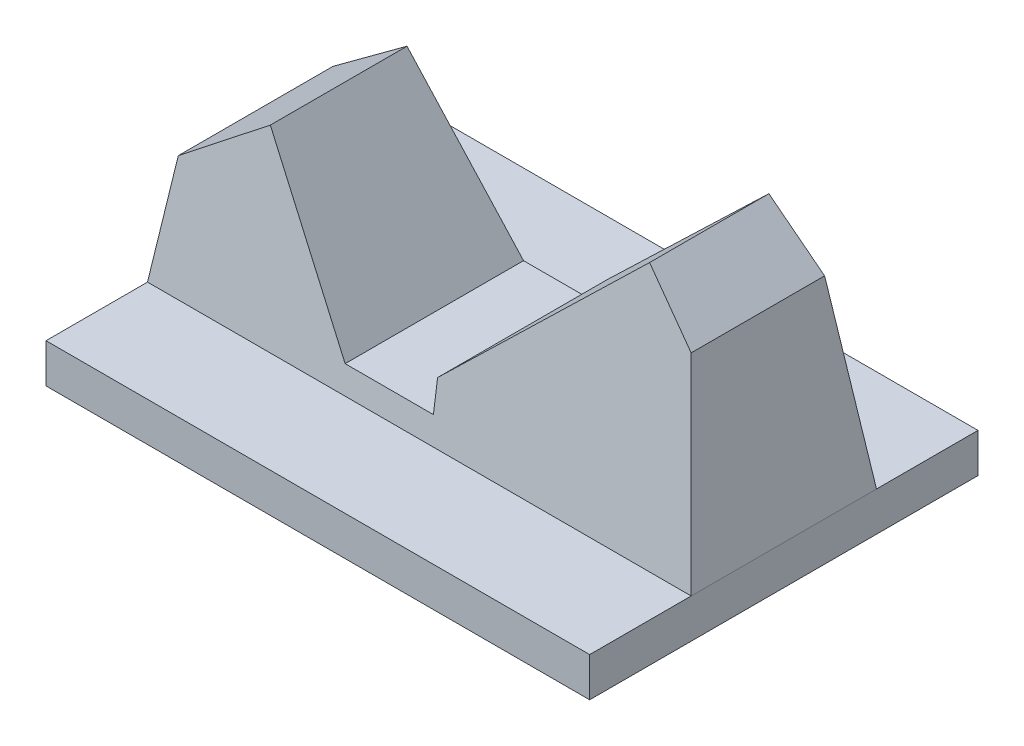
ISO-10303-21;
HEADER;
FILE_DESCRIPTION(('STEP AP214'),'2;1');
FILE_NAME('part.step','',(''),(''),'','','');
FILE_SCHEMA(('AUTOMOTIVE_DESIGN { 1 0 10303 214 1 1 1 1 }'));
ENDSEC;
DATA;
#1=APPLICATION_CONTEXT('core data for automotive mechanical design processes');
#2=APPLICATION_PROTOCOL_DEFINITION('international standard','automotive_design',2000,#1);
#3=PRODUCT_CONTEXT('',#1,'mechanical');
#4=PRODUCT('Part','Part','',(#3));
#5=PRODUCT_RELATED_PRODUCT_CATEGORY('part','',(#4));
#6=PRODUCT_DEFINITION_FORMATION('','',#4);
#7=PRODUCT_DEFINITION_CONTEXT('part definition',#1,'design');
#8=PRODUCT_DEFINITION('design','',#6,#7);
#9=PRODUCT_DEFINITION_SHAPE('','',#8);
#10=(LENGTH_UNIT() NAMED_UNIT(*) SI_UNIT(.MILLI.,.METRE.));
#11=(NAMED_UNIT(*) PLANE_ANGLE_UNIT() SI_UNIT($,.RADIAN.));
#12=(NAMED_UNIT(*) SI_UNIT($,.STERADIAN.) SOLID_ANGLE_UNIT());
#13=UNCERTAINTY_MEASURE_WITH_UNIT(LENGTH_MEASURE(1.E-05),#10,'distance_accuracy_value','');
#14=(GEOMETRIC_REPRESENTATION_CONTEXT(3) GLOBAL_UNCERTAINTY_ASSIGNED_CONTEXT((#13)) GLOBAL_UNIT_ASSIGNED_CONTEXT((#10,
#11,#12)) REPRESENTATION_CONTEXT('',''));
#15=CARTESIAN_POINT('',(0.,0.,0.));
#16=DIRECTION('',(0.,0.,1.));
#17=DIRECTION('',(1.,0.,0.));
#18=AXIS2_PLACEMENT_3D('',#15,#16,#17);
#19=CARTESIAN_POINT('',(-39.116,5.6388,-13.335));
#20=DIRECTION('',(-0.99026806874157,0.139173100960065,0.));
#21=DIRECTION('',(-0.139173100960065,-0.99026806874157,0.));
#22=AXIS2_PLACEMENT_3D('',#19,#20,#21);
#23=PLANE('',#22);
#24=DIRECTION('',(0.,0.,-1.));
#25=VECTOR('',#24,1.);
#26=CARTESIAN_POINT('',(-36.9012837934714,21.397324639607,-13.335));
#27=LINE('',#26,#25);
#28=CARTESIAN_POINT('',(-36.9012837934714,21.397324639607,-11.1202837934714));
#29=VERTEX_POINT('',#28);
#30=CARTESIAN_POINT('',(-36.9012837934714,21.397324639607,11.1202837934714));
#31=VERTEX_POINT('',#30);
#32=EDGE_CURVE('E250',#29,#31,#27,.F.);
#33=ORIENTED_EDGE('',*,*,#32,.F.);
#34=DIRECTION('',(-0.137844537491629,-0.980814848463989,-0.137844537491629));
#35=VECTOR('',#34,1.);
#36=CARTESIAN_POINT('',(-39.116,5.6388,-13.335));
#37=LINE('',#36,#35);
#38=CARTESIAN_POINT('',(-39.116,5.6388,-13.335));
#39=VERTEX_POINT('',#38);
#40=EDGE_CURVE('E173',#29,#39,#37,.T.);
#41=ORIENTED_EDGE('',*,*,#40,.T.);
#42=DIRECTION('',(0.,0.,1.));
#43=VECTOR('',#42,1.);
#44=CARTESIAN_POINT('',(-39.116,5.6388,-13.335));
#45=LINE('',#44,#43);
#46=CARTESIAN_POINT('',(-39.116,5.6388,13.335));
#47=VERTEX_POINT('',#46);
#48=EDGE_CURVE('E246',#39,#47,#45,.T.);
#49=ORIENTED_EDGE('',*,*,#48,.T.);
#50=DIRECTION('',(-0.137844537491629,-0.980814848463989,0.137844537491629));
#51=VECTOR('',#50,1.);
#52=CARTESIAN_POINT('',(-39.116,5.6388,13.335));
#53=LINE('',#52,#51);
#54=EDGE_CURVE('E184',#31,#47,#53,.T.);
#55=ORIENTED_EDGE('',*,*,#54,.F.);
#56=EDGE_LOOP('',(#33,#41,#49,#55));
#57=FACE_BOUND('',#56,.T.);
#58=ADVANCED_FACE('F36',(#57),#23,.T.);
#59=CARTESIAN_POINT('',(-39.116,5.6388,13.335));
#60=DIRECTION('',(0.,0.139173100960065,0.99026806874157));
#61=DIRECTION('',(0.,-0.99026806874157,0.139173100960065));
#62=AXIS2_PLACEMENT_3D('',#59,#60,#61);
#63=PLANE('',#62);
#64=DIRECTION('',(-0.791535572648888,-0.605175687040123,0.0850518961982123));
#65=VECTOR('',#64,1.);
#66=CARTESIAN_POINT('',(-45.9865832763187,14.4510766799637,12.0965152797695));
#67=LINE('',#66,#65);
#68=CARTESIAN_POINT('',(-24.9417813520281,30.5410704884988,9.83521411956165));
#69=VERTEX_POINT('',#68);
#70=EDGE_CURVE('E170',#31,#69,#67,.F.);
#71=ORIENTED_EDGE('',*,*,#70,.F.);
#72=ORIENTED_EDGE('',*,*,#54,.T.);
#73=DIRECTION('',(1.,0.,0.));
#74=VECTOR('',#73,1.);
#75=CARTESIAN_POINT('',(-39.116,5.6388,13.335));
#76=LINE('',#75,#74);
#77=CARTESIAN_POINT('',(39.116,5.6388,13.335));
#78=VERTEX_POINT('',#77);
#79=EDGE_CURVE('E245',#47,#78,#76,.T.);
#80=ORIENTED_EDGE('',*,*,#79,.T.);
#81=DIRECTION('',(0.137844537491629,-0.980814848463989,0.137844537491629));
#82=VECTOR('',#81,1.);
#83=CARTESIAN_POINT('',(38.6092402225108,9.24458317726891,12.8282402225108));
#84=LINE('',#83,#82);
#85=CARTESIAN_POINT('',(35.3829233518817,32.2010205533605,9.6019233518817));
#86=VERTEX_POINT('',#85);
#87=EDGE_CURVE('E179',#86,#78,#84,.T.);
#88=ORIENTED_EDGE('',*,*,#87,.F.);
#89=DIRECTION('',(-0.691135465148828,0.715691725097354,-0.100583912434777));
#90=VECTOR('',#89,1.);
#91=CARTESIAN_POINT('',(13.1954021093097,55.1768713879159,6.37287809759564));
#92=LINE('',#91,#90);
#93=CARTESIAN_POINT('',(28.3827094650445,39.4499542361981,8.58315216139342));
#94=VERTEX_POINT('',#93);
#95=EDGE_CURVE('E259',#94,#86,#92,.F.);
#96=ORIENTED_EDGE('',*,*,#95,.F.);
#97=DIRECTION('',(-0.715936026723942,-0.691371384487291,0.097165911465192));
#98=VECTOR('',#97,1.);
#99=CARTESIAN_POINT('',(-23.2810527045669,-10.4411609552982,15.5948911346395));
#100=LINE('',#99,#98);
#101=CARTESIAN_POINT('',(1.524,13.5128,12.2283814675534));
#102=VERTEX_POINT('',#101);
#103=EDGE_CURVE('E143',#102,#94,#100,.F.);
#104=ORIENTED_EDGE('',*,*,#103,.F.);
#105=DIRECTION('',(0.,-0.99026806874157,0.139173100960065));
#106=VECTOR('',#105,1.);
#107=CARTESIAN_POINT('',(1.524,5.6388,13.335));
#108=LINE('',#107,#106);
#109=CARTESIAN_POINT('',(1.524,9.1948,12.8352367917983));
#110=VERTEX_POINT('',#109);
#111=EDGE_CURVE('E265',#110,#102,#108,.F.);
#112=ORIENTED_EDGE('',*,*,#111,.F.);
#113=DIRECTION('',(-1.,0.,0.));
#114=VECTOR('',#113,1.);
#115=CARTESIAN_POINT('',(-39.116,9.19479999999999,12.8352367917983));
#116=LINE('',#115,#114);
#117=CARTESIAN_POINT('',(-11.176,9.1948,12.8352367917983));
#118=VERTEX_POINT('',#117);
#119=EDGE_CURVE('E263',#118,#110,#116,.F.);
#120=ORIENTED_EDGE('',*,*,#119,.F.);
#121=DIRECTION('',(-0.538218757914415,0.834603056275649,-0.117295810174147));
#122=VECTOR('',#121,1.);
#123=CARTESIAN_POINT('',(-17.6407411425429,19.2195206851442,11.4263541790498));
#124=LINE('',#123,#122);
#125=EDGE_CURVE('E261',#69,#118,#124,.F.);
#126=ORIENTED_EDGE('',*,*,#125,.F.);
#127=EDGE_LOOP('',(#71,#72,#80,#88,#96,#104,#112,#120,#126));
#128=FACE_BOUND('',#127,.T.);
#129=ADVANCED_FACE('F258',(#128),#63,.T.);
#130=CARTESIAN_POINT('',(39.116,5.6388,-13.335));
#131=DIRECTION('',(0.99026806874157,0.139173100960065,0.));
#132=DIRECTION('',(-0.139173100960065,0.99026806874157,0.));
#133=AXIS2_PLACEMENT_3D('',#130,#131,#132);
#134=PLANE('',#133);
#135=DIRECTION('',(0.,0.,1.));
#136=VECTOR('',#135,1.);
#137=CARTESIAN_POINT('',(35.3829233518817,32.2010205533605,-13.335));
#138=LINE('',#137,#136);
#139=CARTESIAN_POINT('',(35.3829233518817,32.2010205533605,-9.6019233518817));
#140=VERTEX_POINT('',#139);
#141=EDGE_CURVE('E51',#86,#140,#138,.F.);
#142=ORIENTED_EDGE('',*,*,#141,.F.);
#143=ORIENTED_EDGE('',*,*,#87,.T.);
#144=DIRECTION('',(0.,0.,-1.));
#145=VECTOR('',#144,1.);
#146=CARTESIAN_POINT('',(39.116,5.6388,-13.335));
#147=LINE('',#146,#145);
#148=CARTESIAN_POINT('',(39.116,5.6388,-13.335));
#149=VERTEX_POINT('',#148);
#150=EDGE_CURVE('E181',#78,#149,#147,.T.);
#151=ORIENTED_EDGE('',*,*,#150,.T.);
#152=DIRECTION('',(0.137844537491629,-0.980814848463989,-0.137844537491629));
#153=VECTOR('',#152,1.);
#154=CARTESIAN_POINT('',(37.6295046526983,16.2157639866555,-11.8485046526983));
#155=LINE('',#154,#153);
#156=EDGE_CURVE('E58',#140,#149,#155,.T.);
#157=ORIENTED_EDGE('',*,*,#156,.F.);
#158=EDGE_LOOP('',(#142,#143,#151,#157));
#159=FACE_BOUND('',#158,.T.);
#160=ADVANCED_FACE('F255',(#159),#134,.T.);
#161=CARTESIAN_POINT('',(-39.116,5.6388,-13.335));
#162=DIRECTION('',(0.,0.139173100960065,-0.99026806874157));
#163=DIRECTION('',(0.,0.99026806874157,0.139173100960065));
#164=AXIS2_PLACEMENT_3D('',#161,#162,#163);
#165=PLANE('',#164);
#166=DIRECTION('',(0.791535572648888,0.605175687040123,0.085051896198212));
#167=VECTOR('',#166,1.);
#168=CARTESIAN_POINT('',(-45.9865832763187,14.4510766799637,-12.0965152797695));
#169=LINE('',#168,#167);
#170=CARTESIAN_POINT('',(-24.9417813520281,30.5410704884988,-9.83521411956164));
#171=VERTEX_POINT('',#170);
#172=EDGE_CURVE('E12',#171,#29,#169,.F.);
#173=ORIENTED_EDGE('',*,*,#172,.F.);
#174=DIRECTION('',(0.538218757914415,-0.834603056275649,-0.117295810174147));
#175=VECTOR('',#174,1.);
#176=CARTESIAN_POINT('',(-17.6407411425429,19.2195206851442,-11.4263541790498));
#177=LINE('',#176,#175);
#178=CARTESIAN_POINT('',(-11.176,9.1948,-12.8352367917983));
#179=VERTEX_POINT('',#178);
#180=EDGE_CURVE('E44',#179,#171,#177,.F.);
#181=ORIENTED_EDGE('',*,*,#180,.F.);
#182=DIRECTION('',(1.,0.,0.));
#183=VECTOR('',#182,1.);
#184=CARTESIAN_POINT('',(-39.116,9.19479999999999,-12.8352367917983));
#185=LINE('',#184,#183);
#186=CARTESIAN_POINT('',(1.524,9.1948,-12.8352367917983));
#187=VERTEX_POINT('',#186);
#188=EDGE_CURVE('E152',#187,#179,#185,.F.);
#189=ORIENTED_EDGE('',*,*,#188,.F.);
#190=DIRECTION('',(0.,0.99026806874157,0.139173100960065));
#191=VECTOR('',#190,1.);
#192=CARTESIAN_POINT('',(1.524,5.6388,-13.335));
#193=LINE('',#192,#191);
#194=CARTESIAN_POINT('',(1.524,13.5128,-12.2283814675534));
#195=VERTEX_POINT('',#194);
#196=EDGE_CURVE('E150',#195,#187,#193,.F.);
#197=ORIENTED_EDGE('',*,*,#196,.F.);
#198=DIRECTION('',(0.715936026723942,0.691371384487291,0.0971659114651918));
#199=VECTOR('',#198,1.);
#200=CARTESIAN_POINT('',(-23.2810527045669,-10.4411609552982,-15.5948911346395));
#201=LINE('',#200,#199);
#202=CARTESIAN_POINT('',(28.3827094650445,39.4499542361981,-8.58315216139342));
#203=VERTEX_POINT('',#202);
#204=EDGE_CURVE('E135',#203,#195,#201,.F.);
#205=ORIENTED_EDGE('',*,*,#204,.F.);
#206=DIRECTION('',(0.691135465148828,-0.715691725097354,-0.100583912434777));
#207=VECTOR('',#206,1.);
#208=CARTESIAN_POINT('',(13.1954021093097,55.1768713879159,-6.37287809759563));
#209=LINE('',#208,#207);
#210=EDGE_CURVE('E129',#140,#203,#209,.F.);
#211=ORIENTED_EDGE('',*,*,#210,.F.);
#212=ORIENTED_EDGE('',*,*,#156,.T.);
#213=DIRECTION('',(-1.,0.,0.));
#214=VECTOR('',#213,1.);
#215=CARTESIAN_POINT('',(-39.116,5.6388,-13.335));
#216=LINE('',#215,#214);
#217=EDGE_CURVE('E174',#149,#39,#216,.T.);
#218=ORIENTED_EDGE('',*,*,#217,.T.);
#219=ORIENTED_EDGE('',*,*,#40,.F.);
#220=EDGE_LOOP('',(#173,#181,#189,#197,#205,#211,#212,#218,#219));
#221=FACE_BOUND('',#220,.T.);
#222=ADVANCED_FACE('F148',(#221),#165,.T.);
#223=CARTESIAN_POINT('',(0.,5.6388,0.));
#224=DIRECTION('',(0.,1.,0.));
#225=DIRECTION('',(0.,0.,1.));
#226=AXIS2_PLACEMENT_3D('',#223,#224,#225);
#227=PLANE('',#226);
#228=ORIENTED_EDGE('',*,*,#217,.F.);
#229=DIRECTION('',(0.,0.,1.));
#230=VECTOR('',#229,1.);
#231=CARTESIAN_POINT('',(39.116,5.6388,-27.94));
#232=LINE('',#231,#230);
#233=CARTESIAN_POINT('',(39.116,5.6388,-27.94));
#234=VERTEX_POINT('',#233);
#235=EDGE_CURVE('E195',#234,#149,#232,.T.);
#236=ORIENTED_EDGE('',*,*,#235,.F.);
#237=DIRECTION('',(1.,0.,0.));
#238=VECTOR('',#237,1.);
#239=CARTESIAN_POINT('',(-39.116,5.6388,-27.94));
#240=LINE('',#239,#238);
#241=CARTESIAN_POINT('',(-39.116,5.6388,-27.94));
#242=VERTEX_POINT('',#241);
#243=EDGE_CURVE('E198',#242,#234,#240,.T.);
#244=ORIENTED_EDGE('',*,*,#243,.F.);
#245=DIRECTION('',(0.,0.,1.));
#246=VECTOR('',#245,1.);
#247=CARTESIAN_POINT('',(-39.116,5.6388,-27.94));
#248=LINE('',#247,#246);
#249=EDGE_CURVE('E187',#242,#39,#248,.T.);
#250=ORIENTED_EDGE('',*,*,#249,.T.);
#251=EDGE_LOOP('',(#228,#236,#244,#250));
#252=FACE_BOUND('',#251,.T.);
#253=ADVANCED_FACE('F309',(#252),#227,.T.);
#254=CARTESIAN_POINT('',(-39.116,5.6388,-27.94));
#255=DIRECTION('',(1.,0.,0.));
#256=DIRECTION('',(0.,0.,-1.));
#257=AXIS2_PLACEMENT_3D('',#254,#255,#256);
#258=PLANE('',#257);
#259=DIRECTION('',(0.,0.,1.));
#260=VECTOR('',#259,1.);
#261=CARTESIAN_POINT('',(-39.116,0.,-27.94));
#262=LINE('',#261,#260);
#263=CARTESIAN_POINT('',(-39.116,0.,-27.94));
#264=VERTEX_POINT('',#263);
#265=CARTESIAN_POINT('',(-39.116,0.,27.94));
#266=VERTEX_POINT('',#265);
#267=EDGE_CURVE('E202',#264,#266,#262,.T.);
#268=ORIENTED_EDGE('',*,*,#267,.T.);
#269=DIRECTION('',(0.,-1.,0.));
#270=VECTOR('',#269,1.);
#271=CARTESIAN_POINT('',(-39.116,5.6388,27.94));
#272=LINE('',#271,#270);
#273=CARTESIAN_POINT('',(-39.116,5.6388,27.94));
#274=VERTEX_POINT('',#273);
#275=EDGE_CURVE('E136',#274,#266,#272,.T.);
#276=ORIENTED_EDGE('',*,*,#275,.F.);
#277=EDGE_CURVE('E191',#47,#274,#248,.T.);
#278=ORIENTED_EDGE('',*,*,#277,.F.);
#279=ORIENTED_EDGE('',*,*,#48,.F.);
#280=ORIENTED_EDGE('',*,*,#249,.F.);
#281=DIRECTION('',(0.,-1.,0.));
#282=VECTOR('',#281,1.);
#283=CARTESIAN_POINT('',(-39.116,5.6388,-27.94));
#284=LINE('',#283,#282);
#285=EDGE_CURVE('E201',#242,#264,#284,.T.);
#286=ORIENTED_EDGE('',*,*,#285,.T.);
#287=EDGE_LOOP('',(#268,#276,#278,#279,#280,#286));
#288=FACE_BOUND('',#287,.T.);
#289=ADVANCED_FACE('F38',(#288),#258,.F.);
#290=CARTESIAN_POINT('',(-39.116,5.6388,27.94));
#291=DIRECTION('',(0.,0.,-1.));
#292=DIRECTION('',(-1.,0.,0.));
#293=AXIS2_PLACEMENT_3D('',#290,#291,#292);
#294=PLANE('',#293);
#295=DIRECTION('',(1.,0.,0.));
#296=VECTOR('',#295,1.);
#297=CARTESIAN_POINT('',(-39.116,0.,27.94));
#298=LINE('',#297,#296);
#299=CARTESIAN_POINT('',(39.116,0.,27.94));
#300=VERTEX_POINT('',#299);
#301=EDGE_CURVE('E205',#266,#300,#298,.T.);
#302=ORIENTED_EDGE('',*,*,#301,.T.);
#303=DIRECTION('',(0.,-1.,0.));
#304=VECTOR('',#303,1.);
#305=CARTESIAN_POINT('',(39.116,5.6388,27.94));
#306=LINE('',#305,#304);
#307=CARTESIAN_POINT('',(39.116,5.6388,27.94));
#308=VERTEX_POINT('',#307);
#309=EDGE_CURVE('E217',#308,#300,#306,.T.);
#310=ORIENTED_EDGE('',*,*,#309,.F.);
#311=DIRECTION('',(1.,0.,0.));
#312=VECTOR('',#311,1.);
#313=CARTESIAN_POINT('',(-39.116,5.6388,27.94));
#314=LINE('',#313,#312);
#315=EDGE_CURVE('E190',#274,#308,#314,.T.);
#316=ORIENTED_EDGE('',*,*,#315,.F.);
#317=ORIENTED_EDGE('',*,*,#275,.T.);
#318=EDGE_LOOP('',(#302,#310,#316,#317));
#319=FACE_BOUND('',#318,.T.);
#320=ADVANCED_FACE('F222',(#319),#294,.F.);
#321=CARTESIAN_POINT('',(39.116,5.6388,-27.94));
#322=DIRECTION('',(1.,0.,0.));
#323=DIRECTION('',(0.,0.,-1.));
#324=AXIS2_PLACEMENT_3D('',#321,#322,#323);
#325=PLANE('',#324);
#326=DIRECTION('',(0.,0.,1.));
#327=VECTOR('',#326,1.);
#328=CARTESIAN_POINT('',(39.116,0.,-27.94));
#329=LINE('',#328,#327);
#330=CARTESIAN_POINT('',(39.116,0.,-27.94));
#331=VERTEX_POINT('',#330);
#332=EDGE_CURVE('E208',#331,#300,#329,.T.);
#333=ORIENTED_EDGE('',*,*,#332,.F.);
#334=DIRECTION('',(0.,-1.,0.));
#335=VECTOR('',#334,1.);
#336=CARTESIAN_POINT('',(39.116,5.6388,-27.94));
#337=LINE('',#336,#335);
#338=EDGE_CURVE('E215',#234,#331,#337,.T.);
#339=ORIENTED_EDGE('',*,*,#338,.F.);
#340=ORIENTED_EDGE('',*,*,#235,.T.);
#341=ORIENTED_EDGE('',*,*,#150,.F.);
#342=EDGE_CURVE('E194',#78,#308,#232,.T.);
#343=ORIENTED_EDGE('',*,*,#342,.T.);
#344=ORIENTED_EDGE('',*,*,#309,.T.);
#345=EDGE_LOOP('',(#333,#339,#340,#341,#343,#344));
#346=FACE_BOUND('',#345,.T.);
#347=ADVANCED_FACE('F237',(#346),#325,.T.);
#348=CARTESIAN_POINT('',(-39.116,5.6388,-27.94));
#349=DIRECTION('',(0.,0.,-1.));
#350=DIRECTION('',(-1.,0.,0.));
#351=AXIS2_PLACEMENT_3D('',#348,#349,#350);
#352=PLANE('',#351);
#353=DIRECTION('',(1.,0.,0.));
#354=VECTOR('',#353,1.);
#355=CARTESIAN_POINT('',(-39.116,0.,-27.94));
#356=LINE('',#355,#354);
#357=EDGE_CURVE('E211',#264,#331,#356,.T.);
#358=ORIENTED_EDGE('',*,*,#357,.F.);
#359=ORIENTED_EDGE('',*,*,#285,.F.);
#360=ORIENTED_EDGE('',*,*,#243,.T.);
#361=ORIENTED_EDGE('',*,*,#338,.T.);
#362=EDGE_LOOP('',(#358,#359,#360,#361));
#363=FACE_BOUND('',#362,.T.);
#364=ADVANCED_FACE('F232',(#363),#352,.T.);
#365=ORIENTED_EDGE('',*,*,#79,.F.);
#366=ORIENTED_EDGE('',*,*,#277,.T.);
#367=ORIENTED_EDGE('',*,*,#315,.T.);
#368=ORIENTED_EDGE('',*,*,#342,.F.);
#369=EDGE_LOOP('',(#365,#366,#367,#368));
#370=FACE_BOUND('',#369,.T.);
#371=ADVANCED_FACE('F244',(#370),#227,.T.);
#372=CARTESIAN_POINT('',(0.,0.,0.));
#373=DIRECTION('',(0.,1.,0.));
#374=DIRECTION('',(0.,0.,1.));
#375=AXIS2_PLACEMENT_3D('',#372,#373,#374);
#376=PLANE('',#375);
#377=ORIENTED_EDGE('',*,*,#267,.F.);
#378=ORIENTED_EDGE('',*,*,#357,.T.);
#379=ORIENTED_EDGE('',*,*,#332,.T.);
#380=ORIENTED_EDGE('',*,*,#301,.F.);
#381=EDGE_LOOP('',(#377,#378,#379,#380));
#382=FACE_BOUND('',#381,.T.);
#383=ADVANCED_FACE('F230',(#382),#376,.F.);
#384=CARTESIAN_POINT('',(-24.9417813520281,30.5410704884988,-19.0500000005494));
#385=DIRECTION('',(-0.607376502018303,0.794414114172206,0.));
#386=DIRECTION('',(-0.794414114172206,-0.607376502018303,0.));
#387=AXIS2_PLACEMENT_3D('',#384,#385,#386);
#388=PLANE('',#387);
#389=ORIENTED_EDGE('',*,*,#70,.T.);
#390=DIRECTION('',(0.,0.,1.));
#391=VECTOR('',#390,1.);
#392=CARTESIAN_POINT('',(-24.9417813520281,30.5410704884988,-19.0500000005494));
#393=LINE('',#392,#391);
#394=EDGE_CURVE('E162',#171,#69,#393,.T.);
#395=ORIENTED_EDGE('',*,*,#394,.F.);
#396=ORIENTED_EDGE('',*,*,#172,.T.);
#397=ORIENTED_EDGE('',*,*,#32,.T.);
#398=EDGE_LOOP('',(#389,#395,#396,#397));
#399=FACE_BOUND('',#398,.T.);
#400=ADVANCED_FACE('F167',(#399),#388,.T.);
#401=CARTESIAN_POINT('',(-11.176,9.1948,-19.050000000578));
#402=DIRECTION('',(0.840404349940899,0.541959895749137,0.));
#403=DIRECTION('',(-0.541959895749137,0.840404349940899,0.));
#404=AXIS2_PLACEMENT_3D('',#401,#402,#403);
#405=PLANE('',#404);
#406=ORIENTED_EDGE('',*,*,#125,.T.);
#407=DIRECTION('',(0.,0.,1.));
#408=VECTOR('',#407,1.);
#409=CARTESIAN_POINT('',(-11.176,9.1948,-19.050000000578));
#410=LINE('',#409,#408);
#411=EDGE_CURVE('E165',#179,#118,#410,.T.);
#412=ORIENTED_EDGE('',*,*,#411,.F.);
#413=ORIENTED_EDGE('',*,*,#180,.T.);
#414=ORIENTED_EDGE('',*,*,#394,.T.);
#415=EDGE_LOOP('',(#406,#412,#413,#414));
#416=FACE_BOUND('',#415,.T.);
#417=ADVANCED_FACE('F161',(#416),#405,.T.);
#418=CARTESIAN_POINT('',(1.524,9.1948,-19.0500000006044));
#419=DIRECTION('',(0.,1.,0.));
#420=DIRECTION('',(-1.,0.,0.));
#421=AXIS2_PLACEMENT_3D('',#418,#419,#420);
#422=PLANE('',#421);
#423=ORIENTED_EDGE('',*,*,#119,.T.);
#424=DIRECTION('',(0.,0.,1.));
#425=VECTOR('',#424,1.);
#426=CARTESIAN_POINT('',(1.524,9.1948,-19.0500000006044));
#427=LINE('',#426,#425);
#428=EDGE_CURVE('E282',#187,#110,#427,.T.);
#429=ORIENTED_EDGE('',*,*,#428,.F.);
#430=ORIENTED_EDGE('',*,*,#188,.T.);
#431=ORIENTED_EDGE('',*,*,#411,.T.);
#432=EDGE_LOOP('',(#423,#429,#430,#431));
#433=FACE_BOUND('',#432,.T.);
#434=ADVANCED_FACE('F287',(#433),#422,.T.);
#435=CARTESIAN_POINT('',(1.524,13.5128,-19.0500000006044));
#436=DIRECTION('',(-1.,0.,0.));
#437=DIRECTION('',(0.,0.,1.));
#438=AXIS2_PLACEMENT_3D('',#435,#436,#437);
#439=PLANE('',#438);
#440=ORIENTED_EDGE('',*,*,#111,.T.);
#441=DIRECTION('',(0.,0.,1.));
#442=VECTOR('',#441,1.);
#443=CARTESIAN_POINT('',(1.524,13.5128,-19.0500000006044));
#444=LINE('',#443,#442);
#445=EDGE_CURVE('E144',#195,#102,#444,.T.);
#446=ORIENTED_EDGE('',*,*,#445,.F.);
#447=ORIENTED_EDGE('',*,*,#196,.T.);
#448=ORIENTED_EDGE('',*,*,#428,.T.);
#449=EDGE_LOOP('',(#440,#446,#447,#448));
#450=FACE_BOUND('',#449,.T.);
#451=ADVANCED_FACE('F290',(#450),#439,.T.);
#452=CARTESIAN_POINT('',(28.3827094650445,39.4499542361981,-19.0500000006602));
#453=DIRECTION('',(-0.694658370458999,0.71933980033865,0.));
#454=DIRECTION('',(-0.71933980033865,-0.694658370458999,0.));
#455=AXIS2_PLACEMENT_3D('',#452,#453,#454);
#456=PLANE('',#455);
#457=ORIENTED_EDGE('',*,*,#103,.T.);
#458=DIRECTION('',(0.,0.,1.));
#459=VECTOR('',#458,1.);
#460=CARTESIAN_POINT('',(28.3827094650445,39.4499542361981,-19.0500000006602));
#461=LINE('',#460,#459);
#462=EDGE_CURVE('E132',#203,#94,#461,.T.);
#463=ORIENTED_EDGE('',*,*,#462,.F.);
#464=ORIENTED_EDGE('',*,*,#204,.T.);
#465=ORIENTED_EDGE('',*,*,#445,.T.);
#466=EDGE_LOOP('',(#457,#463,#464,#465));
#467=FACE_BOUND('',#466,.T.);
#468=ADVANCED_FACE('F139',(#467),#456,.T.);
#469=CARTESIAN_POINT('',(39.116,28.3353065205303,-19.0500000006825));
#470=DIRECTION('',(0.71933980033865,0.694658370458998,0.));
#471=DIRECTION('',(-0.694658370458998,0.71933980033865,0.));
#472=AXIS2_PLACEMENT_3D('',#469,#470,#471);
#473=PLANE('',#472);
#474=ORIENTED_EDGE('',*,*,#95,.T.);
#475=ORIENTED_EDGE('',*,*,#141,.T.);
#476=ORIENTED_EDGE('',*,*,#210,.T.);
#477=ORIENTED_EDGE('',*,*,#462,.T.);
#478=EDGE_LOOP('',(#474,#475,#476,#477));
#479=FACE_BOUND('',#478,.T.);
#480=ADVANCED_FACE('F131',(#479),#473,.T.);
#481=CLOSED_SHELL('',(#58,#129,#160,#222,#253,#289,#320,#347,#364,#371,#383,#400,#417,#434,#451,
#468,#480));
#482=MANIFOLD_SOLID_BREP('B2',#481);
#483=ADVANCED_BREP_SHAPE_REPRESENTATION('',(#18,#482),#14);
#484=SHAPE_DEFINITION_REPRESENTATION(#9,#483);
ENDSEC;
END-ISO-10303-21;
